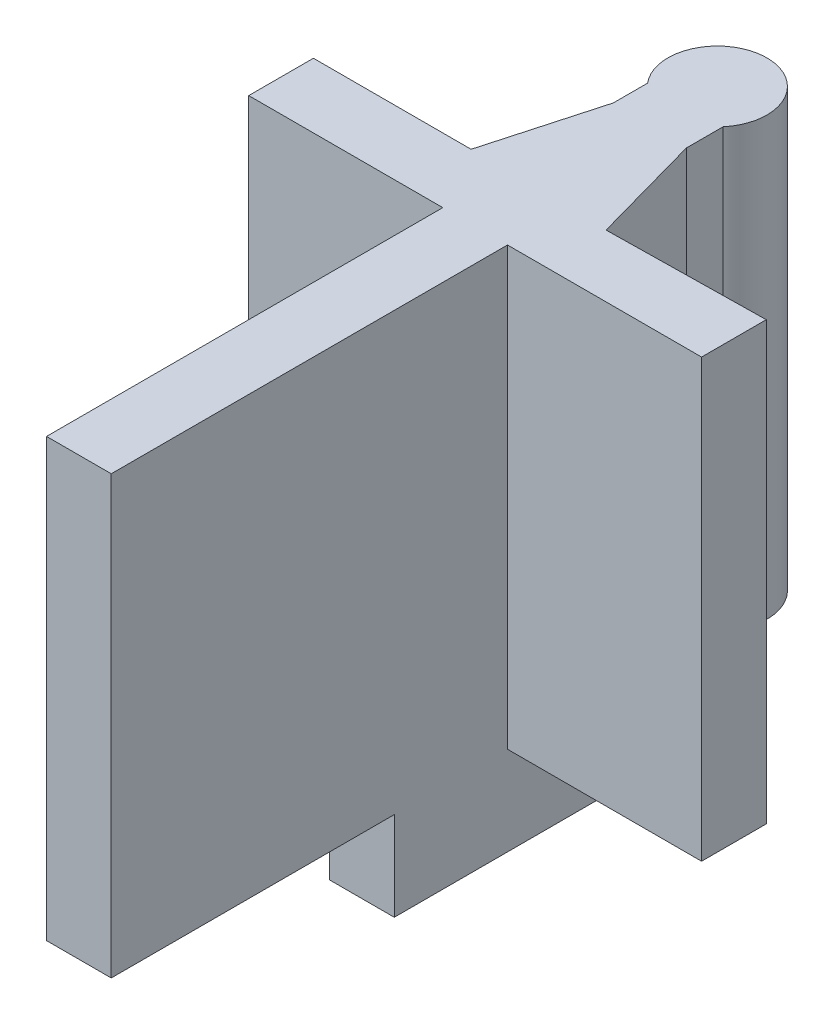
ISO-10303-21;
HEADER;
FILE_DESCRIPTION(('STEP AP214'),'2;1');
FILE_NAME('part.step','',(''),(''),'','','');
FILE_SCHEMA(('AUTOMOTIVE_DESIGN { 1 0 10303 214 1 1 1 1 }'));
ENDSEC;
DATA;
#1=APPLICATION_CONTEXT('core data for automotive mechanical design processes');
#2=APPLICATION_PROTOCOL_DEFINITION('international standard','automotive_design',2000,#1);
#3=PRODUCT_CONTEXT('',#1,'mechanical');
#4=PRODUCT('Part','Part','',(#3));
#5=PRODUCT_RELATED_PRODUCT_CATEGORY('part','',(#4));
#6=PRODUCT_DEFINITION_FORMATION('','',#4);
#7=PRODUCT_DEFINITION_CONTEXT('part definition',#1,'design');
#8=PRODUCT_DEFINITION('design','',#6,#7);
#9=PRODUCT_DEFINITION_SHAPE('','',#8);
#10=(LENGTH_UNIT() NAMED_UNIT(*) SI_UNIT(.MILLI.,.METRE.));
#11=(NAMED_UNIT(*) PLANE_ANGLE_UNIT() SI_UNIT($,.RADIAN.));
#12=(NAMED_UNIT(*) SI_UNIT($,.STERADIAN.) SOLID_ANGLE_UNIT());
#13=UNCERTAINTY_MEASURE_WITH_UNIT(LENGTH_MEASURE(1.E-05),#10,'distance_accuracy_value','');
#14=(GEOMETRIC_REPRESENTATION_CONTEXT(3) GLOBAL_UNCERTAINTY_ASSIGNED_CONTEXT((#13)) GLOBAL_UNIT_ASSIGNED_CONTEXT((#10,
#11,#12)) REPRESENTATION_CONTEXT('',''));
#15=CARTESIAN_POINT('',(0.,0.,0.));
#16=DIRECTION('',(0.,0.,1.));
#17=DIRECTION('',(1.,0.,0.));
#18=AXIS2_PLACEMENT_3D('',#15,#16,#17);
#19=CARTESIAN_POINT('',(3.75643587774983,-7.0406205776768,-51.8142010063338));
#20=DIRECTION('',(0.,1.,0.));
#21=DIRECTION('',(0.,0.,1.));
#22=AXIS2_PLACEMENT_3D('',#19,#20,#21);
#23=PLANE('',#22);
#24=DIRECTION('',(-1.,0.,0.));
#25=VECTOR('',#24,1.);
#26=CARTESIAN_POINT('',(0.656435877749837,-7.0406205776768,-17.744916521261));
#27=LINE('',#26,#25);
#28=CARTESIAN_POINT('',(6.85643587774985,-7.0406205776768,-17.744916521261));
#29=VERTEX_POINT('',#28);
#30=CARTESIAN_POINT('',(0.656435877749839,-7.0406205776768,-17.744916521261));
#31=VERTEX_POINT('',#30);
#32=EDGE_CURVE('E181',#29,#31,#27,.T.);
#33=ORIENTED_EDGE('',*,*,#32,.F.);
#34=DIRECTION('',(0.,0.,-1.));
#35=VECTOR('',#34,1.);
#36=CARTESIAN_POINT('',(6.85643587774985,-7.0406205776768,-28.594916521261));
#37=LINE('',#36,#35);
#38=CARTESIAN_POINT('',(6.85643587774984,-7.0406205776768,9.38008347873901));
#39=VERTEX_POINT('',#38);
#40=EDGE_CURVE('E214',#39,#29,#37,.T.);
#41=ORIENTED_EDGE('',*,*,#40,.F.);
#42=DIRECTION('',(1.,0.,0.));
#43=VECTOR('',#42,1.);
#44=CARTESIAN_POINT('',(6.85643587774984,-7.0406205776768,9.38008347873901));
#45=LINE('',#44,#43);
#46=CARTESIAN_POINT('',(0.656435877749845,-7.0406205776768,9.38008347873901));
#47=VERTEX_POINT('',#46);
#48=EDGE_CURVE('E265',#47,#39,#45,.T.);
#49=ORIENTED_EDGE('',*,*,#48,.F.);
#50=DIRECTION('',(0.,0.,1.));
#51=VECTOR('',#50,1.);
#52=CARTESIAN_POINT('',(0.656435877749845,-7.0406205776768,9.38008347873901));
#53=LINE('',#52,#51);
#54=EDGE_CURVE('E69',#31,#47,#53,.T.);
#55=ORIENTED_EDGE('',*,*,#54,.F.);
#56=EDGE_LOOP('',(#33,#41,#49,#55));
#57=FACE_BOUND('',#56,.T.);
#58=ADVANCED_FACE('F46',(#57),#23,.F.);
#59=DIRECTION('',(0.,0.,-1.));
#60=VECTOR('',#59,1.);
#61=CARTESIAN_POINT('',(0.656435877749839,-7.0406205776768,-28.594916521261));
#62=LINE('',#61,#60);
#63=CARTESIAN_POINT('',(0.656435877749837,-7.0406205776768,-28.594916521261));
#64=VERTEX_POINT('',#63);
#65=CARTESIAN_POINT('',(0.65643587774984,-7.0406205776768,-42.544916521261));
#66=VERTEX_POINT('',#65);
#67=EDGE_CURVE('E13',#64,#66,#62,.T.);
#68=ORIENTED_EDGE('',*,*,#67,.F.);
#69=DIRECTION('',(1.,0.,0.));
#70=VECTOR('',#69,1.);
#71=CARTESIAN_POINT('',(0.656435877749837,-7.0406205776768,-28.594916521261));
#72=LINE('',#71,#70);
#73=CARTESIAN_POINT('',(-17.9435641222502,-7.0406205776768,-28.594916521261));
#74=VERTEX_POINT('',#73);
#75=EDGE_CURVE('E261',#74,#64,#72,.T.);
#76=ORIENTED_EDGE('',*,*,#75,.F.);
#77=DIRECTION('',(0.,0.,1.));
#78=VECTOR('',#77,1.);
#79=CARTESIAN_POINT('',(-17.9435641222502,-7.0406205776768,-28.594916521261));
#80=LINE('',#79,#78);
#81=CARTESIAN_POINT('',(-17.9435641222502,-7.0406205776768,-34.794916521261));
#82=VERTEX_POINT('',#81);
#83=EDGE_CURVE('E259',#82,#74,#80,.T.);
#84=ORIENTED_EDGE('',*,*,#83,.F.);
#85=DIRECTION('',(-1.,0.,0.));
#86=VECTOR('',#85,1.);
#87=CARTESIAN_POINT('',(-17.9435641222502,-7.0406205776768,-34.794916521261));
#88=LINE('',#87,#86);
#89=CARTESIAN_POINT('',(-2.83106412225016,-7.0406205776768,-34.794916521261));
#90=VERTEX_POINT('',#89);
#91=EDGE_CURVE('E257',#90,#82,#88,.T.);
#92=ORIENTED_EDGE('',*,*,#91,.F.);
#93=DIRECTION('',(-0.26824830893403,0.,0.963349803941452));
#94=VECTOR('',#93,1.);
#95=CARTESIAN_POINT('',(-2.83106412225016,-7.0406205776768,-34.794916521261));
#96=LINE('',#95,#94);
#97=CARTESIAN_POINT('',(0.137032003119525,-7.0406205776768,-45.4541256391737));
#98=VERTEX_POINT('',#97);
#99=EDGE_CURVE('E255',#98,#90,#96,.T.);
#100=ORIENTED_EDGE('',*,*,#99,.F.);
#101=DIRECTION('',(0.,0.,1.));
#102=VECTOR('',#101,1.);
#103=CARTESIAN_POINT('',(0.137032003119525,-7.0406205776768,-45.4541256391737));
#104=LINE('',#103,#102);
#105=CARTESIAN_POINT('',(0.137032003119525,-7.0406205776768,-48.744916521261));
#106=VERTEX_POINT('',#105);
#107=EDGE_CURVE('E253',#106,#98,#104,.T.);
#108=ORIENTED_EDGE('',*,*,#107,.F.);
#109=CARTESIAN_POINT('',(3.75643587774983,-7.0406205776768,-51.8142010063338));
#110=DIRECTION('',(0.,1.,0.));
#111=DIRECTION('',(0.,0.,1.));
#112=AXIS2_PLACEMENT_3D('',#109,#110,#111);
#113=CIRCLE('',#112,4.7455865452015);
#114=CARTESIAN_POINT('',(7.37583975238014,-7.0406205776768,-48.744916521261));
#115=VERTEX_POINT('',#114);
#116=EDGE_CURVE('E251',#115,#106,#113,.T.);
#117=ORIENTED_EDGE('',*,*,#116,.F.);
#118=DIRECTION('',(0.,0.,-1.));
#119=VECTOR('',#118,1.);
#120=CARTESIAN_POINT('',(7.37583975238014,-7.0406205776768,-45.213347739789));
#121=LINE('',#120,#119);
#122=CARTESIAN_POINT('',(7.37583975238014,-7.0406205776768,-45.213347739789));
#123=VERTEX_POINT('',#122);
#124=EDGE_CURVE('E249',#123,#115,#121,.T.);
#125=ORIENTED_EDGE('',*,*,#124,.F.);
#126=DIRECTION('',(-0.268311746805712,0.,-0.963332137181184));
#127=VECTOR('',#126,1.);
#128=CARTESIAN_POINT('',(10.3439358777498,-7.0406205776768,-34.5568542472324));
#129=LINE('',#128,#127);
#130=CARTESIAN_POINT('',(10.3439358777498,-7.0406205776768,-34.5568542472324));
#131=VERTEX_POINT('',#130);
#132=EDGE_CURVE('E247',#131,#123,#129,.T.);
#133=ORIENTED_EDGE('',*,*,#132,.F.);
#134=DIRECTION('',(-0.999875949729744,0.,0.0157507190960587));
#135=VECTOR('',#134,1.);
#136=CARTESIAN_POINT('',(25.4564358777498,-7.0406205776768,-34.794916521261));
#137=LINE('',#136,#135);
#138=CARTESIAN_POINT('',(25.4564358777498,-7.0406205776768,-34.794916521261));
#139=VERTEX_POINT('',#138);
#140=EDGE_CURVE('E245',#139,#131,#137,.T.);
#141=ORIENTED_EDGE('',*,*,#140,.F.);
#142=DIRECTION('',(0.,0.,-1.));
#143=VECTOR('',#142,1.);
#144=CARTESIAN_POINT('',(25.4564358777498,-7.0406205776768,-28.594916521261));
#145=LINE('',#144,#143);
#146=CARTESIAN_POINT('',(25.4564358777498,-7.0406205776768,-28.594916521261));
#147=VERTEX_POINT('',#146);
#148=EDGE_CURVE('E243',#147,#139,#145,.T.);
#149=ORIENTED_EDGE('',*,*,#148,.F.);
#150=DIRECTION('',(1.,0.,0.));
#151=VECTOR('',#150,1.);
#152=CARTESIAN_POINT('',(6.85643587774985,-7.0406205776768,-28.594916521261));
#153=LINE('',#152,#151);
#154=CARTESIAN_POINT('',(6.85643587774985,-7.0406205776768,-28.594916521261));
#155=VERTEX_POINT('',#154);
#156=EDGE_CURVE('E188',#155,#147,#153,.T.);
#157=ORIENTED_EDGE('',*,*,#156,.F.);
#158=DIRECTION('',(0.,0.,1.));
#159=VECTOR('',#158,1.);
#160=CARTESIAN_POINT('',(6.85643587774985,-7.0406205776768,-17.744916521261));
#161=LINE('',#160,#159);
#162=CARTESIAN_POINT('',(6.85643587774985,-7.0406205776768,-42.544916521261));
#163=VERTEX_POINT('',#162);
#164=EDGE_CURVE('E201',#163,#155,#161,.T.);
#165=ORIENTED_EDGE('',*,*,#164,.F.);
#166=DIRECTION('',(1.,0.,0.));
#167=VECTOR('',#166,1.);
#168=CARTESIAN_POINT('',(6.85643587774985,-7.0406205776768,-42.544916521261));
#169=LINE('',#168,#167);
#170=EDGE_CURVE('E62',#66,#163,#169,.T.);
#171=ORIENTED_EDGE('',*,*,#170,.F.);
#172=EDGE_LOOP('',(#68,#76,#84,#92,#100,#108,#117,#125,#133,#141,#149,#157,#165,#171));
#173=FACE_BOUND('',#172,.T.);
#174=ADVANCED_FACE('F315',(#173),#23,.F.);
#175=CARTESIAN_POINT('',(6.85643587774985,34.8093794223232,-28.594916521261));
#176=DIRECTION('',(0.,0.,-1.));
#177=DIRECTION('',(-1.,0.,0.));
#178=AXIS2_PLACEMENT_3D('',#175,#176,#177);
#179=PLANE('',#178);
#180=ORIENTED_EDGE('',*,*,#156,.T.);
#181=DIRECTION('',(0.,-1.,0.));
#182=VECTOR('',#181,1.);
#183=CARTESIAN_POINT('',(25.4564358777498,34.8093794223232,-28.594916521261));
#184=LINE('',#183,#182);
#185=CARTESIAN_POINT('',(25.4564358777498,34.8093794223232,-28.594916521261));
#186=VERTEX_POINT('',#185);
#187=EDGE_CURVE('E50',#186,#147,#184,.T.);
#188=ORIENTED_EDGE('',*,*,#187,.F.);
#189=DIRECTION('',(1.,0.,0.));
#190=VECTOR('',#189,1.);
#191=CARTESIAN_POINT('',(6.85643587774985,34.8093794223232,-28.594916521261));
#192=LINE('',#191,#190);
#193=CARTESIAN_POINT('',(6.85643587774985,34.8093794223232,-28.594916521261));
#194=VERTEX_POINT('',#193);
#195=EDGE_CURVE('E210',#194,#186,#192,.T.);
#196=ORIENTED_EDGE('',*,*,#195,.F.);
#197=DIRECTION('',(0.,-1.,0.));
#198=VECTOR('',#197,1.);
#199=CARTESIAN_POINT('',(6.85643587774985,34.8093794223232,-28.594916521261));
#200=LINE('',#199,#198);
#201=EDGE_CURVE('E240',#194,#155,#200,.T.);
#202=ORIENTED_EDGE('',*,*,#201,.T.);
#203=EDGE_LOOP('',(#180,#188,#196,#202));
#204=FACE_BOUND('',#203,.T.);
#205=ADVANCED_FACE('F48',(#204),#179,.F.);
#206=CARTESIAN_POINT('',(25.4564358777498,34.8093794223232,-28.594916521261));
#207=DIRECTION('',(-1.,0.,0.));
#208=DIRECTION('',(0.,0.,1.));
#209=AXIS2_PLACEMENT_3D('',#206,#207,#208);
#210=PLANE('',#209);
#211=ORIENTED_EDGE('',*,*,#148,.T.);
#212=DIRECTION('',(0.,-1.,0.));
#213=VECTOR('',#212,1.);
#214=CARTESIAN_POINT('',(25.4564358777498,34.8093794223232,-34.794916521261));
#215=LINE('',#214,#213);
#216=CARTESIAN_POINT('',(25.4564358777498,34.8093794223232,-34.794916521261));
#217=VERTEX_POINT('',#216);
#218=EDGE_CURVE('E301',#217,#139,#215,.T.);
#219=ORIENTED_EDGE('',*,*,#218,.F.);
#220=DIRECTION('',(0.,0.,-1.));
#221=VECTOR('',#220,1.);
#222=CARTESIAN_POINT('',(25.4564358777498,34.8093794223232,-28.594916521261));
#223=LINE('',#222,#221);
#224=EDGE_CURVE('E213',#186,#217,#223,.T.);
#225=ORIENTED_EDGE('',*,*,#224,.F.);
#226=ORIENTED_EDGE('',*,*,#187,.T.);
#227=EDGE_LOOP('',(#211,#219,#225,#226));
#228=FACE_BOUND('',#227,.T.);
#229=ADVANCED_FACE('F310',(#228),#210,.F.);
#230=CARTESIAN_POINT('',(25.4564358777498,34.8093794223232,-34.794916521261));
#231=DIRECTION('',(0.0157507190960587,0.,0.999875949729744));
#232=DIRECTION('',(0.999875949729744,0.,-0.0157507190960587));
#233=AXIS2_PLACEMENT_3D('',#230,#231,#232);
#234=PLANE('',#233);
#235=ORIENTED_EDGE('',*,*,#140,.T.);
#236=DIRECTION('',(0.,-1.,0.));
#237=VECTOR('',#236,1.);
#238=CARTESIAN_POINT('',(10.3439358777498,34.8093794223232,-34.5568542472324));
#239=LINE('',#238,#237);
#240=CARTESIAN_POINT('',(10.3439358777498,34.8093794223232,-34.5568542472324));
#241=VERTEX_POINT('',#240);
#242=EDGE_CURVE('E299',#241,#131,#239,.T.);
#243=ORIENTED_EDGE('',*,*,#242,.F.);
#244=DIRECTION('',(-0.999875949729744,0.,0.0157507190960587));
#245=VECTOR('',#244,1.);
#246=CARTESIAN_POINT('',(25.4564358777498,34.8093794223232,-34.794916521261));
#247=LINE('',#246,#245);
#248=EDGE_CURVE('E216',#217,#241,#247,.T.);
#249=ORIENTED_EDGE('',*,*,#248,.F.);
#250=ORIENTED_EDGE('',*,*,#218,.T.);
#251=EDGE_LOOP('',(#235,#243,#249,#250));
#252=FACE_BOUND('',#251,.T.);
#253=ADVANCED_FACE('F375',(#252),#234,.F.);
#254=CARTESIAN_POINT('',(10.3439358777498,34.8093794223232,-34.5568542472324));
#255=DIRECTION('',(-0.963332137181184,0.,0.268311746805712));
#256=DIRECTION('',(0.268311746805712,0.,0.963332137181184));
#257=AXIS2_PLACEMENT_3D('',#254,#255,#256);
#258=PLANE('',#257);
#259=ORIENTED_EDGE('',*,*,#132,.T.);
#260=DIRECTION('',(0.,-1.,0.));
#261=VECTOR('',#260,1.);
#262=CARTESIAN_POINT('',(7.37583975238014,34.8093794223232,-45.213347739789));
#263=LINE('',#262,#261);
#264=CARTESIAN_POINT('',(7.37583975238014,34.8093794223232,-45.213347739789));
#265=VERTEX_POINT('',#264);
#266=EDGE_CURVE('E296',#265,#123,#263,.T.);
#267=ORIENTED_EDGE('',*,*,#266,.F.);
#268=DIRECTION('',(-0.268311746805712,0.,-0.963332137181184));
#269=VECTOR('',#268,1.);
#270=CARTESIAN_POINT('',(10.3439358777498,34.8093794223232,-34.5568542472324));
#271=LINE('',#270,#269);
#272=EDGE_CURVE('E218',#241,#265,#271,.T.);
#273=ORIENTED_EDGE('',*,*,#272,.F.);
#274=ORIENTED_EDGE('',*,*,#242,.T.);
#275=EDGE_LOOP('',(#259,#267,#273,#274));
#276=FACE_BOUND('',#275,.T.);
#277=ADVANCED_FACE('F371',(#276),#258,.F.);
#278=CARTESIAN_POINT('',(7.37583975238014,34.8093794223232,-45.213347739789));
#279=DIRECTION('',(-1.,0.,0.));
#280=DIRECTION('',(0.,0.,1.));
#281=AXIS2_PLACEMENT_3D('',#278,#279,#280);
#282=PLANE('',#281);
#283=ORIENTED_EDGE('',*,*,#124,.T.);
#284=DIRECTION('',(0.,-1.,0.));
#285=VECTOR('',#284,1.);
#286=CARTESIAN_POINT('',(7.37583975238014,34.8093794223232,-48.744916521261));
#287=LINE('',#286,#285);
#288=CARTESIAN_POINT('',(7.37583975238014,34.8093794223232,-48.744916521261));
#289=VERTEX_POINT('',#288);
#290=EDGE_CURVE('E293',#289,#115,#287,.T.);
#291=ORIENTED_EDGE('',*,*,#290,.F.);
#292=DIRECTION('',(0.,0.,-1.));
#293=VECTOR('',#292,1.);
#294=CARTESIAN_POINT('',(7.37583975238014,34.8093794223232,-45.213347739789));
#295=LINE('',#294,#293);
#296=EDGE_CURVE('E220',#265,#289,#295,.T.);
#297=ORIENTED_EDGE('',*,*,#296,.F.);
#298=ORIENTED_EDGE('',*,*,#266,.T.);
#299=EDGE_LOOP('',(#283,#291,#297,#298));
#300=FACE_BOUND('',#299,.T.);
#301=ADVANCED_FACE('F367',(#300),#282,.F.);
#302=CARTESIAN_POINT('',(3.75643587774983,34.8093794223232,-51.8142010063338));
#303=DIRECTION('',(0.,-1.,0.));
#304=DIRECTION('',(0.,0.,-1.));
#305=AXIS2_PLACEMENT_3D('',#302,#303,#304);
#306=CYLINDRICAL_SURFACE('',#305,4.7455865452015);
#307=ORIENTED_EDGE('',*,*,#116,.T.);
#308=DIRECTION('',(0.,-1.,0.));
#309=VECTOR('',#308,1.);
#310=CARTESIAN_POINT('',(0.137032003119525,34.8093794223232,-48.744916521261));
#311=LINE('',#310,#309);
#312=CARTESIAN_POINT('',(0.137032003119525,34.8093794223232,-48.744916521261));
#313=VERTEX_POINT('',#312);
#314=EDGE_CURVE('E290',#313,#106,#311,.T.);
#315=ORIENTED_EDGE('',*,*,#314,.F.);
#316=CARTESIAN_POINT('',(3.75643587774983,34.8093794223232,-51.8142010063338));
#317=DIRECTION('',(0.,1.,0.));
#318=DIRECTION('',(0.,0.,1.));
#319=AXIS2_PLACEMENT_3D('',#316,#317,#318);
#320=CIRCLE('',#319,4.7455865452015);
#321=EDGE_CURVE('E222',#289,#313,#320,.T.);
#322=ORIENTED_EDGE('',*,*,#321,.F.);
#323=ORIENTED_EDGE('',*,*,#290,.T.);
#324=EDGE_LOOP('',(#307,#315,#322,#323));
#325=FACE_BOUND('',#324,.T.);
#326=ADVANCED_FACE('F363',(#325),#306,.T.);
#327=CARTESIAN_POINT('',(0.137032003119525,34.8093794223232,-45.4541256391737));
#328=DIRECTION('',(1.,0.,0.));
#329=DIRECTION('',(0.,0.,-1.));
#330=AXIS2_PLACEMENT_3D('',#327,#328,#329);
#331=PLANE('',#330);
#332=ORIENTED_EDGE('',*,*,#107,.T.);
#333=DIRECTION('',(0.,-1.,0.));
#334=VECTOR('',#333,1.);
#335=CARTESIAN_POINT('',(0.137032003119525,34.8093794223232,-45.4541256391737));
#336=LINE('',#335,#334);
#337=CARTESIAN_POINT('',(0.137032003119525,34.8093794223232,-45.4541256391737));
#338=VERTEX_POINT('',#337);
#339=EDGE_CURVE('E287',#338,#98,#336,.T.);
#340=ORIENTED_EDGE('',*,*,#339,.F.);
#341=DIRECTION('',(0.,0.,1.));
#342=VECTOR('',#341,1.);
#343=CARTESIAN_POINT('',(0.137032003119525,34.8093794223232,-45.4541256391737));
#344=LINE('',#343,#342);
#345=EDGE_CURVE('E224',#313,#338,#344,.T.);
#346=ORIENTED_EDGE('',*,*,#345,.F.);
#347=ORIENTED_EDGE('',*,*,#314,.T.);
#348=EDGE_LOOP('',(#332,#340,#346,#347));
#349=FACE_BOUND('',#348,.T.);
#350=ADVANCED_FACE('F359',(#349),#331,.F.);
#351=CARTESIAN_POINT('',(-2.83106412225016,34.8093794223232,-34.794916521261));
#352=DIRECTION('',(0.963349803941452,0.,0.26824830893403));
#353=DIRECTION('',(0.26824830893403,0.,-0.963349803941452));
#354=AXIS2_PLACEMENT_3D('',#351,#352,#353);
#355=PLANE('',#354);
#356=ORIENTED_EDGE('',*,*,#99,.T.);
#357=DIRECTION('',(0.,-1.,0.));
#358=VECTOR('',#357,1.);
#359=CARTESIAN_POINT('',(-2.83106412225016,34.8093794223232,-34.794916521261));
#360=LINE('',#359,#358);
#361=CARTESIAN_POINT('',(-2.83106412225016,34.8093794223232,-34.794916521261));
#362=VERTEX_POINT('',#361);
#363=EDGE_CURVE('E284',#362,#90,#360,.T.);
#364=ORIENTED_EDGE('',*,*,#363,.F.);
#365=DIRECTION('',(-0.26824830893403,0.,0.963349803941452));
#366=VECTOR('',#365,1.);
#367=CARTESIAN_POINT('',(-2.83106412225016,34.8093794223232,-34.794916521261));
#368=LINE('',#367,#366);
#369=EDGE_CURVE('E226',#338,#362,#368,.T.);
#370=ORIENTED_EDGE('',*,*,#369,.F.);
#371=ORIENTED_EDGE('',*,*,#339,.T.);
#372=EDGE_LOOP('',(#356,#364,#370,#371));
#373=FACE_BOUND('',#372,.T.);
#374=ADVANCED_FACE('F355',(#373),#355,.F.);
#375=CARTESIAN_POINT('',(-17.9435641222502,34.8093794223232,-34.794916521261));
#376=DIRECTION('',(0.,0.,1.));
#377=DIRECTION('',(1.,0.,0.));
#378=AXIS2_PLACEMENT_3D('',#375,#376,#377);
#379=PLANE('',#378);
#380=ORIENTED_EDGE('',*,*,#91,.T.);
#381=DIRECTION('',(0.,-1.,0.));
#382=VECTOR('',#381,1.);
#383=CARTESIAN_POINT('',(-17.9435641222502,34.8093794223232,-34.794916521261));
#384=LINE('',#383,#382);
#385=CARTESIAN_POINT('',(-17.9435641222502,34.8093794223232,-34.794916521261));
#386=VERTEX_POINT('',#385);
#387=EDGE_CURVE('E281',#386,#82,#384,.T.);
#388=ORIENTED_EDGE('',*,*,#387,.F.);
#389=DIRECTION('',(-1.,0.,0.));
#390=VECTOR('',#389,1.);
#391=CARTESIAN_POINT('',(-17.9435641222502,34.8093794223232,-34.794916521261));
#392=LINE('',#391,#390);
#393=EDGE_CURVE('E228',#362,#386,#392,.T.);
#394=ORIENTED_EDGE('',*,*,#393,.F.);
#395=ORIENTED_EDGE('',*,*,#363,.T.);
#396=EDGE_LOOP('',(#380,#388,#394,#395));
#397=FACE_BOUND('',#396,.T.);
#398=ADVANCED_FACE('F351',(#397),#379,.F.);
#399=CARTESIAN_POINT('',(-17.9435641222502,34.8093794223232,-28.594916521261));
#400=DIRECTION('',(1.,0.,0.));
#401=DIRECTION('',(0.,0.,-1.));
#402=AXIS2_PLACEMENT_3D('',#399,#400,#401);
#403=PLANE('',#402);
#404=ORIENTED_EDGE('',*,*,#83,.T.);
#405=DIRECTION('',(0.,-1.,0.));
#406=VECTOR('',#405,1.);
#407=CARTESIAN_POINT('',(-17.9435641222502,34.8093794223232,-28.594916521261));
#408=LINE('',#407,#406);
#409=CARTESIAN_POINT('',(-17.9435641222502,34.8093794223232,-28.594916521261));
#410=VERTEX_POINT('',#409);
#411=EDGE_CURVE('E278',#410,#74,#408,.T.);
#412=ORIENTED_EDGE('',*,*,#411,.F.);
#413=DIRECTION('',(0.,0.,1.));
#414=VECTOR('',#413,1.);
#415=CARTESIAN_POINT('',(-17.9435641222502,34.8093794223232,-28.594916521261));
#416=LINE('',#415,#414);
#417=EDGE_CURVE('E230',#386,#410,#416,.T.);
#418=ORIENTED_EDGE('',*,*,#417,.F.);
#419=ORIENTED_EDGE('',*,*,#387,.T.);
#420=EDGE_LOOP('',(#404,#412,#418,#419));
#421=FACE_BOUND('',#420,.T.);
#422=ADVANCED_FACE('F347',(#421),#403,.F.);
#423=CARTESIAN_POINT('',(0.656435877749837,34.8093794223232,-28.594916521261));
#424=DIRECTION('',(0.,0.,-1.));
#425=DIRECTION('',(-1.,0.,0.));
#426=AXIS2_PLACEMENT_3D('',#423,#424,#425);
#427=PLANE('',#426);
#428=ORIENTED_EDGE('',*,*,#75,.T.);
#429=DIRECTION('',(0.,-1.,0.));
#430=VECTOR('',#429,1.);
#431=CARTESIAN_POINT('',(0.656435877749837,34.8093794223232,-28.594916521261));
#432=LINE('',#431,#430);
#433=CARTESIAN_POINT('',(0.656435877749837,34.8093794223232,-28.594916521261));
#434=VERTEX_POINT('',#433);
#435=EDGE_CURVE('E276',#434,#64,#432,.T.);
#436=ORIENTED_EDGE('',*,*,#435,.F.);
#437=DIRECTION('',(1.,0.,0.));
#438=VECTOR('',#437,1.);
#439=CARTESIAN_POINT('',(0.656435877749837,34.8093794223232,-28.594916521261));
#440=LINE('',#439,#438);
#441=EDGE_CURVE('E232',#410,#434,#440,.T.);
#442=ORIENTED_EDGE('',*,*,#441,.F.);
#443=ORIENTED_EDGE('',*,*,#411,.T.);
#444=EDGE_LOOP('',(#428,#436,#442,#443));
#445=FACE_BOUND('',#444,.T.);
#446=ADVANCED_FACE('F344',(#445),#427,.F.);
#447=CARTESIAN_POINT('',(0.656435877749845,34.8093794223232,9.38008347873901));
#448=DIRECTION('',(1.,0.,0.));
#449=DIRECTION('',(0.,0.,-1.));
#450=AXIS2_PLACEMENT_3D('',#447,#448,#449);
#451=PLANE('',#450);
#452=ORIENTED_EDGE('',*,*,#435,.T.);
#453=ORIENTED_EDGE('',*,*,#67,.T.);
#454=DIRECTION('',(0.,1.,0.));
#455=VECTOR('',#454,1.);
#456=CARTESIAN_POINT('',(0.65643587774984,-15.5656205776768,-42.544916521261));
#457=LINE('',#456,#455);
#458=CARTESIAN_POINT('',(0.65643587774984,-15.5656205776768,-42.544916521261));
#459=VERTEX_POINT('',#458);
#460=EDGE_CURVE('E184',#459,#66,#457,.T.);
#461=ORIENTED_EDGE('',*,*,#460,.F.);
#462=DIRECTION('',(0.,0.,-1.));
#463=VECTOR('',#462,1.);
#464=CARTESIAN_POINT('',(0.656435877749837,-15.5656205776768,-17.744916521261));
#465=LINE('',#464,#463);
#466=CARTESIAN_POINT('',(0.656435877749837,-15.5656205776768,-17.744916521261));
#467=VERTEX_POINT('',#466);
#468=EDGE_CURVE('E170',#467,#459,#465,.T.);
#469=ORIENTED_EDGE('',*,*,#468,.F.);
#470=DIRECTION('',(0.,1.,0.));
#471=VECTOR('',#470,1.);
#472=CARTESIAN_POINT('',(0.656435877749837,-15.5656205776768,-17.744916521261));
#473=LINE('',#472,#471);
#474=EDGE_CURVE('E198',#467,#31,#473,.T.);
#475=ORIENTED_EDGE('',*,*,#474,.T.);
#476=ORIENTED_EDGE('',*,*,#54,.T.);
#477=DIRECTION('',(0.,-1.,0.));
#478=VECTOR('',#477,1.);
#479=CARTESIAN_POINT('',(0.656435877749845,34.8093794223232,9.38008347873901));
#480=LINE('',#479,#478);
#481=CARTESIAN_POINT('',(0.656435877749845,34.8093794223232,9.38008347873901));
#482=VERTEX_POINT('',#481);
#483=EDGE_CURVE('E273',#482,#47,#480,.T.);
#484=ORIENTED_EDGE('',*,*,#483,.F.);
#485=DIRECTION('',(0.,0.,1.));
#486=VECTOR('',#485,1.);
#487=CARTESIAN_POINT('',(0.656435877749845,34.8093794223232,9.38008347873901));
#488=LINE('',#487,#486);
#489=EDGE_CURVE('E234',#434,#482,#488,.T.);
#490=ORIENTED_EDGE('',*,*,#489,.F.);
#491=EDGE_LOOP('',(#452,#453,#461,#469,#475,#476,#484,#490));
#492=FACE_BOUND('',#491,.T.);
#493=ADVANCED_FACE('F186',(#492),#451,.F.);
#494=CARTESIAN_POINT('',(6.85643587774984,34.8093794223232,9.38008347873901));
#495=DIRECTION('',(0.,0.,-1.));
#496=DIRECTION('',(-1.,0.,0.));
#497=AXIS2_PLACEMENT_3D('',#494,#495,#496);
#498=PLANE('',#497);
#499=ORIENTED_EDGE('',*,*,#48,.T.);
#500=DIRECTION('',(0.,-1.,0.));
#501=VECTOR('',#500,1.);
#502=CARTESIAN_POINT('',(6.85643587774984,34.8093794223232,9.38008347873901));
#503=LINE('',#502,#501);
#504=CARTESIAN_POINT('',(6.85643587774984,34.8093794223232,9.38008347873901));
#505=VERTEX_POINT('',#504);
#506=EDGE_CURVE('E270',#505,#39,#503,.T.);
#507=ORIENTED_EDGE('',*,*,#506,.F.);
#508=DIRECTION('',(1.,0.,0.));
#509=VECTOR('',#508,1.);
#510=CARTESIAN_POINT('',(6.85643587774984,34.8093794223232,9.38008347873901));
#511=LINE('',#510,#509);
#512=EDGE_CURVE('E236',#482,#505,#511,.T.);
#513=ORIENTED_EDGE('',*,*,#512,.F.);
#514=ORIENTED_EDGE('',*,*,#483,.T.);
#515=EDGE_LOOP('',(#499,#507,#513,#514));
#516=FACE_BOUND('',#515,.T.);
#517=ADVANCED_FACE('F327',(#516),#498,.F.);
#518=CARTESIAN_POINT('',(6.85643587774985,34.8093794223232,-28.594916521261));
#519=DIRECTION('',(-1.,0.,0.));
#520=DIRECTION('',(0.,0.,1.));
#521=AXIS2_PLACEMENT_3D('',#518,#519,#520);
#522=PLANE('',#521);
#523=ORIENTED_EDGE('',*,*,#40,.T.);
#524=DIRECTION('',(0.,1.,0.));
#525=VECTOR('',#524,1.);
#526=CARTESIAN_POINT('',(6.85643587774985,-15.5656205776768,-17.744916521261));
#527=LINE('',#526,#525);
#528=CARTESIAN_POINT('',(6.85643587774985,-15.5656205776768,-17.744916521261));
#529=VERTEX_POINT('',#528);
#530=EDGE_CURVE('E206',#529,#29,#527,.T.);
#531=ORIENTED_EDGE('',*,*,#530,.F.);
#532=DIRECTION('',(0.,0.,1.));
#533=VECTOR('',#532,1.);
#534=CARTESIAN_POINT('',(6.85643587774985,-15.5656205776768,-28.594916521261));
#535=LINE('',#534,#533);
#536=CARTESIAN_POINT('',(6.85643587774985,-15.5656205776768,-42.544916521261));
#537=VERTEX_POINT('',#536);
#538=EDGE_CURVE('E194',#537,#529,#535,.T.);
#539=ORIENTED_EDGE('',*,*,#538,.F.);
#540=DIRECTION('',(0.,1.,0.));
#541=VECTOR('',#540,1.);
#542=CARTESIAN_POINT('',(6.85643587774985,-15.5656205776768,-42.544916521261));
#543=LINE('',#542,#541);
#544=EDGE_CURVE('E189',#537,#163,#543,.T.);
#545=ORIENTED_EDGE('',*,*,#544,.T.);
#546=ORIENTED_EDGE('',*,*,#164,.T.);
#547=ORIENTED_EDGE('',*,*,#201,.F.);
#548=DIRECTION('',(0.,0.,-1.));
#549=VECTOR('',#548,1.);
#550=CARTESIAN_POINT('',(6.85643587774985,34.8093794223232,-28.594916521261));
#551=LINE('',#550,#549);
#552=EDGE_CURVE('E238',#505,#194,#551,.T.);
#553=ORIENTED_EDGE('',*,*,#552,.F.);
#554=ORIENTED_EDGE('',*,*,#506,.T.);
#555=EDGE_LOOP('',(#523,#531,#539,#545,#546,#547,#553,#554));
#556=FACE_BOUND('',#555,.T.);
#557=ADVANCED_FACE('F317',(#556),#522,.F.);
#558=CARTESIAN_POINT('',(3.75643587774983,34.8093794223232,-51.8142010063338));
#559=DIRECTION('',(0.,1.,0.));
#560=DIRECTION('',(0.,0.,1.));
#561=AXIS2_PLACEMENT_3D('',#558,#559,#560);
#562=PLANE('',#561);
#563=ORIENTED_EDGE('',*,*,#195,.T.);
#564=ORIENTED_EDGE('',*,*,#224,.T.);
#565=ORIENTED_EDGE('',*,*,#248,.T.);
#566=ORIENTED_EDGE('',*,*,#272,.T.);
#567=ORIENTED_EDGE('',*,*,#296,.T.);
#568=ORIENTED_EDGE('',*,*,#321,.T.);
#569=ORIENTED_EDGE('',*,*,#345,.T.);
#570=ORIENTED_EDGE('',*,*,#369,.T.);
#571=ORIENTED_EDGE('',*,*,#393,.T.);
#572=ORIENTED_EDGE('',*,*,#417,.T.);
#573=ORIENTED_EDGE('',*,*,#441,.T.);
#574=ORIENTED_EDGE('',*,*,#489,.T.);
#575=ORIENTED_EDGE('',*,*,#512,.T.);
#576=ORIENTED_EDGE('',*,*,#552,.T.);
#577=EDGE_LOOP('',(#563,#564,#565,#566,#567,#568,#569,#570,#571,#572,#573,#574,#575,#576));
#578=FACE_BOUND('',#577,.T.);
#579=ADVANCED_FACE('F336',(#578),#562,.T.);
#580=CARTESIAN_POINT('',(6.85643587774985,-15.5656205776768,-42.544916521261));
#581=DIRECTION('',(0.,0.,1.));
#582=DIRECTION('',(1.,0.,0.));
#583=AXIS2_PLACEMENT_3D('',#580,#581,#582);
#584=PLANE('',#583);
#585=ORIENTED_EDGE('',*,*,#170,.T.);
#586=ORIENTED_EDGE('',*,*,#544,.F.);
#587=DIRECTION('',(1.,0.,0.));
#588=VECTOR('',#587,1.);
#589=CARTESIAN_POINT('',(6.85643587774985,-15.5656205776768,-42.544916521261));
#590=LINE('',#589,#588);
#591=EDGE_CURVE('E174',#459,#537,#590,.T.);
#592=ORIENTED_EDGE('',*,*,#591,.F.);
#593=ORIENTED_EDGE('',*,*,#460,.T.);
#594=EDGE_LOOP('',(#585,#586,#592,#593));
#595=FACE_BOUND('',#594,.T.);
#596=ADVANCED_FACE('F191',(#595),#584,.F.);
#597=CARTESIAN_POINT('',(0.656435877749837,-15.5656205776768,-17.744916521261));
#598=DIRECTION('',(0.,0.,-1.));
#599=DIRECTION('',(-1.,0.,0.));
#600=AXIS2_PLACEMENT_3D('',#597,#598,#599);
#601=PLANE('',#600);
#602=ORIENTED_EDGE('',*,*,#32,.T.);
#603=ORIENTED_EDGE('',*,*,#474,.F.);
#604=DIRECTION('',(-1.,0.,0.));
#605=VECTOR('',#604,1.);
#606=CARTESIAN_POINT('',(0.656435877749837,-15.5656205776768,-17.744916521261));
#607=LINE('',#606,#605);
#608=EDGE_CURVE('E177',#529,#467,#607,.T.);
#609=ORIENTED_EDGE('',*,*,#608,.F.);
#610=ORIENTED_EDGE('',*,*,#530,.T.);
#611=EDGE_LOOP('',(#602,#603,#609,#610));
#612=FACE_BOUND('',#611,.T.);
#613=ADVANCED_FACE('F322',(#612),#601,.F.);
#614=CARTESIAN_POINT('',(-2.04750977083562,-15.5656205776768,15.3577395822795));
#615=DIRECTION('',(0.,1.,0.));
#616=DIRECTION('',(0.,0.,1.));
#617=AXIS2_PLACEMENT_3D('',#614,#615,#616);
#618=PLANE('',#617);
#619=ORIENTED_EDGE('',*,*,#468,.T.);
#620=ORIENTED_EDGE('',*,*,#591,.T.);
#621=ORIENTED_EDGE('',*,*,#538,.T.);
#622=ORIENTED_EDGE('',*,*,#608,.T.);
#623=EDGE_LOOP('',(#619,#620,#621,#622));
#624=FACE_BOUND('',#623,.T.);
#625=ADVANCED_FACE('F172',(#624),#618,.F.);
#626=CLOSED_SHELL('',(#58,#174,#205,#229,#253,#277,#301,#326,#350,#374,#398,#422,#446,#493,#517,
#557,#579,#596,#613,#625));
#627=MANIFOLD_SOLID_BREP('B2',#626);
#628=ADVANCED_BREP_SHAPE_REPRESENTATION('',(#18,#627),#14);
#629=SHAPE_DEFINITION_REPRESENTATION(#9,#628);
ENDSEC;
END-ISO-10303-21;
